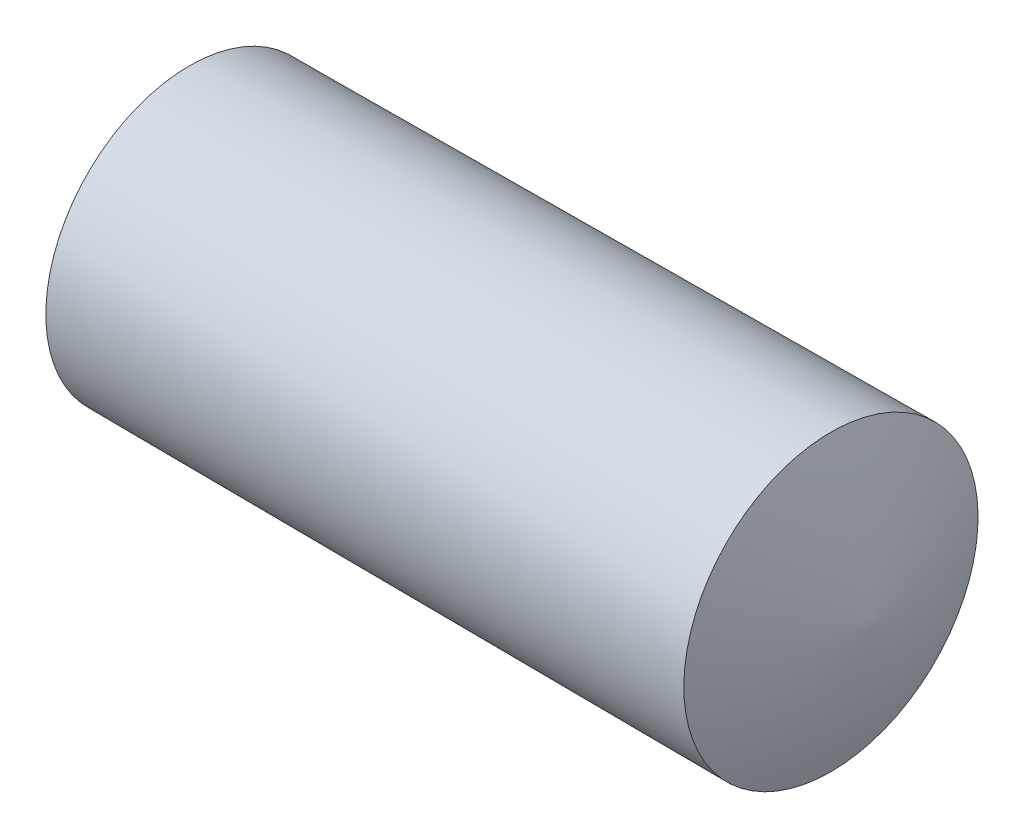
ISO-10303-21;
HEADER;
FILE_DESCRIPTION(('STEP AP214'),'2;1');
FILE_NAME('part.step','',(''),(''),'','','');
FILE_SCHEMA(('AUTOMOTIVE_DESIGN { 1 0 10303 214 1 1 1 1 }'));
ENDSEC;
DATA;
#1=APPLICATION_CONTEXT('core data for automotive mechanical design processes');
#2=APPLICATION_PROTOCOL_DEFINITION('international standard','automotive_design',2000,#1);
#3=PRODUCT_CONTEXT('',#1,'mechanical');
#4=PRODUCT('Part','Part','',(#3));
#5=PRODUCT_RELATED_PRODUCT_CATEGORY('part','',(#4));
#6=PRODUCT_DEFINITION_FORMATION('','',#4);
#7=PRODUCT_DEFINITION_CONTEXT('part definition',#1,'design');
#8=PRODUCT_DEFINITION('design','',#6,#7);
#9=PRODUCT_DEFINITION_SHAPE('','',#8);
#10=(LENGTH_UNIT() NAMED_UNIT(*) SI_UNIT(.MILLI.,.METRE.));
#11=(NAMED_UNIT(*) PLANE_ANGLE_UNIT() SI_UNIT($,.RADIAN.));
#12=(NAMED_UNIT(*) SI_UNIT($,.STERADIAN.) SOLID_ANGLE_UNIT());
#13=UNCERTAINTY_MEASURE_WITH_UNIT(LENGTH_MEASURE(1.E-05),#10,'distance_accuracy_value','');
#14=(GEOMETRIC_REPRESENTATION_CONTEXT(3) GLOBAL_UNCERTAINTY_ASSIGNED_CONTEXT((#13)) GLOBAL_UNIT_ASSIGNED_CONTEXT((#10,
#11,#12)) REPRESENTATION_CONTEXT('',''));
#15=CARTESIAN_POINT('',(0.,0.,0.));
#16=DIRECTION('',(0.,0.,1.));
#17=DIRECTION('',(1.,0.,0.));
#18=AXIS2_PLACEMENT_3D('',#15,#16,#17);
#19=CARTESIAN_POINT('',(8.77738379044973,1.5659690107866,0.));
#20=DIRECTION('',(0.,0.,-1.));
#21=DIRECTION('',(0.,-1.,0.));
#22=AXIS2_PLACEMENT_3D('',#19,#20,#21);
#23=CIRCLE('',#22,12.);
#24=TRIMMED_CURVE('',#23,(PARAMETER_VALUE(-1.43992565578974)),
(PARAMETER_VALUE(1.43992565578974)),.T.,.PARAMETER.);
#25=CARTESIAN_POINT('',(8.77738379044973,0.,0.));
#26=DIRECTION('',(-1.,0.,0.));
#27=AXIS1_PLACEMENT('',#25,#26);
#28=SURFACE_OF_REVOLUTION('',#24,#27);
#29=CARTESIAN_POINT('',(-2.32,0.,0.));
#30=DIRECTION('',(-1.,0.,0.));
#31=DIRECTION('',(0.,-1.,0.));
#32=AXIS2_PLACEMENT_3D('',#29,#30,#31);
#33=CIRCLE('',#32,3.);
#34=CARTESIAN_POINT('',(-2.32,-3.,0.));
#35=VERTEX_POINT('',#34);
#36=EDGE_CURVE('E11',#35,#35,#33,.T.);
#37=ORIENTED_EDGE('',*,*,#36,.T.);
#38=EDGE_LOOP('',(#37));
#39=FACE_BOUND('',#38,.T.);
#40=CARTESIAN_POINT('',(-3.12,0.,0.));
#41=VERTEX_POINT('',#40);
#42=VERTEX_LOOP('',#41);
#43=FACE_BOUND('',#42,.T.);
#44=ADVANCED_FACE('F44',(#39,#43),#28,.T.);
#45=CARTESIAN_POINT('',(-2.32,0.,0.));
#46=DIRECTION('',(1.,0.,0.));
#47=DIRECTION('',(0.,1.,0.));
#48=AXIS2_PLACEMENT_3D('',#45,#46,#47);
#49=CONICAL_SURFACE('',#48,3.,0.0054160211609972);
#50=CARTESIAN_POINT('',(11.08,0.,0.));
#51=DIRECTION('',(-1.,0.,0.));
#52=DIRECTION('',(0.,-1.,0.));
#53=AXIS2_PLACEMENT_3D('',#50,#51,#52);
#54=CIRCLE('',#53,3.07257539318365);
#55=CARTESIAN_POINT('',(11.08,-3.07257539318365,0.));
#56=VERTEX_POINT('',#55);
#57=EDGE_CURVE('E52',#56,#56,#54,.T.);
#58=ORIENTED_EDGE('',*,*,#57,.T.);
#59=EDGE_LOOP('',(#58));
#60=FACE_BOUND('',#59,.T.);
#61=ORIENTED_EDGE('',*,*,#36,.F.);
#62=EDGE_LOOP('',(#61));
#63=FACE_BOUND('',#62,.T.);
#64=ADVANCED_FACE('F61',(#60,#63),#49,.T.);
#65=CARTESIAN_POINT('',(-0.434897028037315,1.5659690107866,0.));
#66=DIRECTION('',(0.,0.,-1.));
#67=DIRECTION('',(0.,-1.,0.));
#68=AXIS2_PLACEMENT_3D('',#65,#66,#67);
#69=CIRCLE('',#68,12.4140625);
#70=TRIMMED_CURVE('',#69,(PARAMETER_VALUE(-1.44431459568957)),
(PARAMETER_VALUE(1.44431459568957)),.T.,.PARAMETER.);
#71=CARTESIAN_POINT('',(-0.434897028037315,0.,0.));
#72=DIRECTION('',(-1.,0.,0.));
#73=AXIS1_PLACEMENT('',#71,#72);
#74=SURFACE_OF_REVOLUTION('',#70,#73);
#75=CARTESIAN_POINT('',(11.88,0.,0.));
#76=VERTEX_POINT('',#75);
#77=VERTEX_LOOP('',#76);
#78=FACE_BOUND('',#77,.T.);
#79=ORIENTED_EDGE('',*,*,#57,.F.);
#80=EDGE_LOOP('',(#79));
#81=FACE_BOUND('',#80,.T.);
#82=ADVANCED_FACE('F58',(#78,#81),#74,.T.);
#83=CLOSED_SHELL('',(#44,#64,#82));
#84=MANIFOLD_SOLID_BREP('B2',#83);
#85=ADVANCED_BREP_SHAPE_REPRESENTATION('',(#18,#84),#14);
#86=SHAPE_DEFINITION_REPRESENTATION(#9,#85);
ENDSEC;
END-ISO-10303-21;
